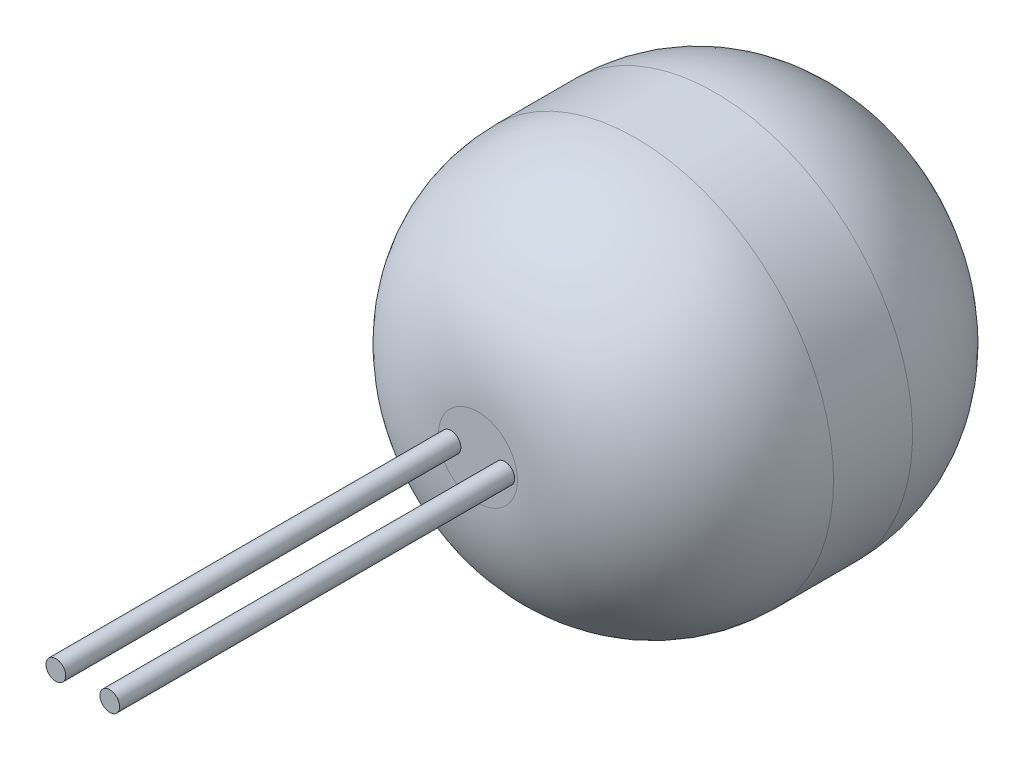
ISO-10303-21;
HEADER;
FILE_DESCRIPTION(('STEP AP214'),'2;1');
FILE_NAME('part.step','',(''),(''),'','','');
FILE_SCHEMA(('AUTOMOTIVE_DESIGN { 1 0 10303 214 1 1 1 1 }'));
ENDSEC;
DATA;
#1=APPLICATION_CONTEXT('core data for automotive mechanical design processes');
#2=APPLICATION_PROTOCOL_DEFINITION('international standard','automotive_design',2000,#1);
#3=PRODUCT_CONTEXT('',#1,'mechanical');
#4=PRODUCT('Part','Part','',(#3));
#5=PRODUCT_RELATED_PRODUCT_CATEGORY('part','',(#4));
#6=PRODUCT_DEFINITION_FORMATION('','',#4);
#7=PRODUCT_DEFINITION_CONTEXT('part definition',#1,'design');
#8=PRODUCT_DEFINITION('design','',#6,#7);
#9=PRODUCT_DEFINITION_SHAPE('','',#8);
#10=(LENGTH_UNIT() NAMED_UNIT(*) SI_UNIT(.MILLI.,.METRE.));
#11=(NAMED_UNIT(*) PLANE_ANGLE_UNIT() SI_UNIT($,.RADIAN.));
#12=(NAMED_UNIT(*) SI_UNIT($,.STERADIAN.) SOLID_ANGLE_UNIT());
#13=UNCERTAINTY_MEASURE_WITH_UNIT(LENGTH_MEASURE(1.E-05),#10,'distance_accuracy_value','');
#14=(GEOMETRIC_REPRESENTATION_CONTEXT(3) GLOBAL_UNCERTAINTY_ASSIGNED_CONTEXT((#13)) GLOBAL_UNIT_ASSIGNED_CONTEXT((#10,
#11,#12)) REPRESENTATION_CONTEXT('',''));
#15=CARTESIAN_POINT('',(0.,0.,0.));
#16=DIRECTION('',(0.,0.,1.));
#17=DIRECTION('',(1.,0.,0.));
#18=AXIS2_PLACEMENT_3D('',#15,#16,#17);
#19=CARTESIAN_POINT('',(0.,0.,2.));
#20=DIRECTION('',(0.,0.,-1.));
#21=DIRECTION('',(-1.,0.,0.));
#22=AXIS2_PLACEMENT_3D('',#19,#20,#21);
#23=CYLINDRICAL_SURFACE('',#22,1.);
#24=CARTESIAN_POINT('',(0.,0.,0.8));
#25=DIRECTION('',(0.,0.,-1.));
#26=DIRECTION('',(-1.,0.,0.));
#27=AXIS2_PLACEMENT_3D('',#24,#25,#26);
#28=CIRCLE('',#27,1.);
#29=CARTESIAN_POINT('',(-1.,0.,0.8));
#30=VERTEX_POINT('',#29);
#31=EDGE_CURVE('E41',#30,#30,#28,.F.);
#32=ORIENTED_EDGE('',*,*,#31,.T.);
#33=EDGE_LOOP('',(#32));
#34=FACE_BOUND('',#33,.T.);
#35=CARTESIAN_POINT('',(0.,0.,1.2));
#36=DIRECTION('',(0.,0.,1.));
#37=DIRECTION('',(1.,0.,0.));
#38=AXIS2_PLACEMENT_3D('',#35,#36,#37);
#39=CIRCLE('',#38,1.);
#40=CARTESIAN_POINT('',(1.,0.,1.2));
#41=VERTEX_POINT('',#40);
#42=EDGE_CURVE('E45',#41,#41,#39,.F.);
#43=ORIENTED_EDGE('',*,*,#42,.T.);
#44=EDGE_LOOP('',(#43));
#45=FACE_BOUND('',#44,.T.);
#46=ADVANCED_FACE('F34',(#34,#45),#23,.T.);
#47=CARTESIAN_POINT('',(1.,0.,2.));
#48=DIRECTION('',(0.,0.,1.));
#49=DIRECTION('',(1.,0.,0.));
#50=AXIS2_PLACEMENT_3D('',#47,#48,#49);
#51=PLANE('',#50);
#52=CARTESIAN_POINT('',(0.,0.,2.));
#53=DIRECTION('',(0.,0.,1.));
#54=DIRECTION('',(1.,0.,0.));
#55=AXIS2_PLACEMENT_3D('',#52,#53,#54);
#56=CIRCLE('',#55,0.2);
#57=CARTESIAN_POINT('',(0.2,0.,2.));
#58=VERTEX_POINT('',#57);
#59=EDGE_CURVE('E10',#58,#58,#56,.T.);
#60=ORIENTED_EDGE('',*,*,#59,.T.);
#61=EDGE_LOOP('',(#60));
#62=FACE_BOUND('',#61,.T.);
#63=CARTESIAN_POINT('',(-0.136275076217566,0.,2.));
#64=DIRECTION('',(0.,0.,1.));
#65=DIRECTION('',(1.,0.,0.));
#66=AXIS2_PLACEMENT_3D('',#63,#64,#65);
#67=CIRCLE('',#66,0.05);
#68=CARTESIAN_POINT('',(-0.0862750762175658,0.,2.));
#69=VERTEX_POINT('',#68);
#70=EDGE_CURVE('E61',#69,#69,#67,.T.);
#71=ORIENTED_EDGE('',*,*,#70,.F.);
#72=EDGE_LOOP('',(#71));
#73=FACE_BOUND('',#72,.T.);
#74=CARTESIAN_POINT('',(0.136233706431234,0.,2.));
#75=DIRECTION('',(0.,0.,1.));
#76=DIRECTION('',(1.,0.,0.));
#77=AXIS2_PLACEMENT_3D('',#74,#75,#76);
#78=CIRCLE('',#77,0.05);
#79=CARTESIAN_POINT('',(0.186233706431234,0.,2.));
#80=VERTEX_POINT('',#79);
#81=EDGE_CURVE('E55',#80,#80,#78,.T.);
#82=ORIENTED_EDGE('',*,*,#81,.F.);
#83=EDGE_LOOP('',(#82));
#84=FACE_BOUND('',#83,.T.);
#85=ADVANCED_FACE('F76',(#62,#73,#84),#51,.T.);
#86=CARTESIAN_POINT('',(0.,0.,0.));
#87=DIRECTION('',(0.,0.,-1.));
#88=DIRECTION('',(-1.,0.,0.));
#89=AXIS2_PLACEMENT_3D('',#86,#87,#88);
#90=PLANE('',#89);
#91=CARTESIAN_POINT('',(0.,0.,0.));
#92=DIRECTION('',(0.,0.,-1.));
#93=DIRECTION('',(-1.,0.,0.));
#94=AXIS2_PLACEMENT_3D('',#91,#92,#93);
#95=CIRCLE('',#94,0.2);
#96=CARTESIAN_POINT('',(-0.2,0.,0.));
#97=VERTEX_POINT('',#96);
#98=EDGE_CURVE('E49',#97,#97,#95,.T.);
#99=ORIENTED_EDGE('',*,*,#98,.T.);
#100=EDGE_LOOP('',(#99));
#101=FACE_BOUND('',#100,.T.);
#102=ADVANCED_FACE('F79',(#101),#90,.T.);
#103=CARTESIAN_POINT('',(0.136233706431234,0.,4.));
#104=DIRECTION('',(0.,0.,-1.));
#105=DIRECTION('',(-1.,0.,0.));
#106=AXIS2_PLACEMENT_3D('',#103,#104,#105);
#107=CYLINDRICAL_SURFACE('',#106,0.05);
#108=CARTESIAN_POINT('',(0.136233706431234,0.,4.));
#109=DIRECTION('',(0.,0.,1.));
#110=DIRECTION('',(1.,0.,0.));
#111=AXIS2_PLACEMENT_3D('',#108,#109,#110);
#112=CIRCLE('',#111,0.05);
#113=CARTESIAN_POINT('',(0.186233706431234,0.,4.));
#114=VERTEX_POINT('',#113);
#115=EDGE_CURVE('E54',#114,#114,#112,.T.);
#116=ORIENTED_EDGE('',*,*,#115,.F.);
#117=EDGE_LOOP('',(#116));
#118=FACE_BOUND('',#117,.T.);
#119=ORIENTED_EDGE('',*,*,#81,.T.);
#120=EDGE_LOOP('',(#119));
#121=FACE_BOUND('',#120,.T.);
#122=ADVANCED_FACE('F83',(#118,#121),#107,.T.);
#123=CARTESIAN_POINT('',(0.136233706431234,0.,4.));
#124=DIRECTION('',(0.,0.,1.));
#125=DIRECTION('',(1.,0.,0.));
#126=AXIS2_PLACEMENT_3D('',#123,#124,#125);
#127=PLANE('',#126);
#128=ORIENTED_EDGE('',*,*,#115,.T.);
#129=EDGE_LOOP('',(#128));
#130=FACE_BOUND('',#129,.T.);
#131=ADVANCED_FACE('F72',(#130),#127,.T.);
#132=CARTESIAN_POINT('',(-0.136275076217566,0.,4.));
#133=DIRECTION('',(0.,0.,-1.));
#134=DIRECTION('',(-1.,0.,0.));
#135=AXIS2_PLACEMENT_3D('',#132,#133,#134);
#136=CYLINDRICAL_SURFACE('',#135,0.05);
#137=CARTESIAN_POINT('',(-0.136275076217566,0.,4.));
#138=DIRECTION('',(0.,0.,1.));
#139=DIRECTION('',(1.,0.,0.));
#140=AXIS2_PLACEMENT_3D('',#137,#138,#139);
#141=CIRCLE('',#140,0.05);
#142=CARTESIAN_POINT('',(-0.0862750762175658,0.,4.));
#143=VERTEX_POINT('',#142);
#144=EDGE_CURVE('E58',#143,#143,#141,.T.);
#145=ORIENTED_EDGE('',*,*,#144,.F.);
#146=EDGE_LOOP('',(#145));
#147=FACE_BOUND('',#146,.T.);
#148=ORIENTED_EDGE('',*,*,#70,.T.);
#149=EDGE_LOOP('',(#148));
#150=FACE_BOUND('',#149,.T.);
#151=ADVANCED_FACE('F69',(#147,#150),#136,.T.);
#152=CARTESIAN_POINT('',(-0.136275076217566,0.,4.));
#153=DIRECTION('',(0.,0.,1.));
#154=DIRECTION('',(1.,0.,0.));
#155=AXIS2_PLACEMENT_3D('',#152,#153,#154);
#156=PLANE('',#155);
#157=ORIENTED_EDGE('',*,*,#144,.T.);
#158=EDGE_LOOP('',(#157));
#159=FACE_BOUND('',#158,.T.);
#160=ADVANCED_FACE('F67',(#159),#156,.T.);
#161=CARTESIAN_POINT('',(0.,0.,0.8));
#162=DIRECTION('',(0.,0.,-1.));
#163=DIRECTION('',(-1.,0.,0.));
#164=AXIS2_PLACEMENT_3D('',#161,#162,#163);
#165=DEGENERATE_TOROIDAL_SURFACE('',#164,0.2,0.8,.T.);
#166=ORIENTED_EDGE('',*,*,#31,.F.);
#167=EDGE_LOOP('',(#166));
#168=FACE_BOUND('',#167,.T.);
#169=ORIENTED_EDGE('',*,*,#98,.F.);
#170=EDGE_LOOP('',(#169));
#171=FACE_BOUND('',#170,.T.);
#172=ADVANCED_FACE('F101',(#168,#171),#165,.T.);
#173=CARTESIAN_POINT('',(0.,0.,1.2));
#174=DIRECTION('',(0.,0.,1.));
#175=DIRECTION('',(1.,0.,0.));
#176=AXIS2_PLACEMENT_3D('',#173,#174,#175);
#177=DEGENERATE_TOROIDAL_SURFACE('',#176,0.2,0.8,.T.);
#178=ORIENTED_EDGE('',*,*,#59,.F.);
#179=EDGE_LOOP('',(#178));
#180=FACE_BOUND('',#179,.T.);
#181=ORIENTED_EDGE('',*,*,#42,.F.);
#182=EDGE_LOOP('',(#181));
#183=FACE_BOUND('',#182,.T.);
#184=ADVANCED_FACE('F36',(#180,#183),#177,.T.);
#185=CLOSED_SHELL('',(#46,#85,#102,#122,#131,#151,#160,#172,#184));
#186=MANIFOLD_SOLID_BREP('B2',#185);
#187=ADVANCED_BREP_SHAPE_REPRESENTATION('',(#18,#186),#14);
#188=SHAPE_DEFINITION_REPRESENTATION(#9,#187);
ENDSEC;
END-ISO-10303-21;
